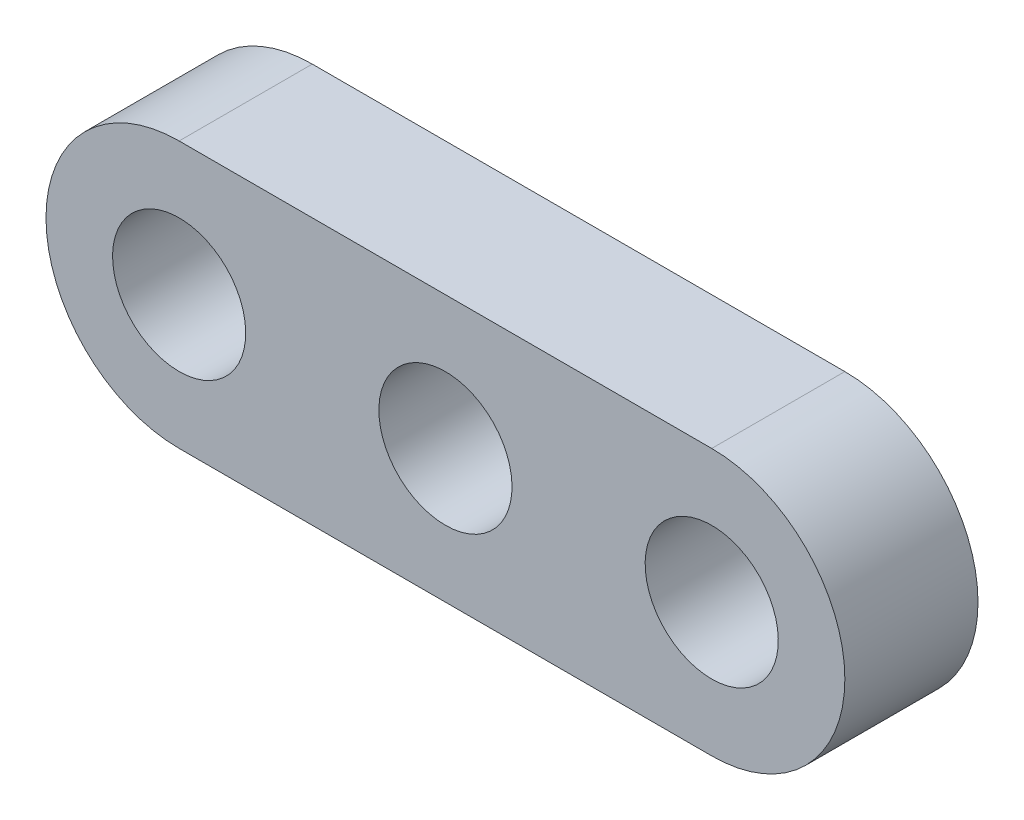
ISO-10303-21;
HEADER;
FILE_DESCRIPTION(('STEP AP214'),'2;1');
FILE_NAME('part.step','',(''),(''),'','','');
FILE_SCHEMA(('AUTOMOTIVE_DESIGN { 1 0 10303 214 1 1 1 1 }'));
ENDSEC;
DATA;
#1=APPLICATION_CONTEXT('core data for automotive mechanical design processes');
#2=APPLICATION_PROTOCOL_DEFINITION('international standard','automotive_design',2000,#1);
#3=PRODUCT_CONTEXT('',#1,'mechanical');
#4=PRODUCT('Part','Part','',(#3));
#5=PRODUCT_RELATED_PRODUCT_CATEGORY('part','',(#4));
#6=PRODUCT_DEFINITION_FORMATION('','',#4);
#7=PRODUCT_DEFINITION_CONTEXT('part definition',#1,'design');
#8=PRODUCT_DEFINITION('design','',#6,#7);
#9=PRODUCT_DEFINITION_SHAPE('','',#8);
#10=(LENGTH_UNIT() NAMED_UNIT(*) SI_UNIT(.MILLI.,.METRE.));
#11=(NAMED_UNIT(*) PLANE_ANGLE_UNIT() SI_UNIT($,.RADIAN.));
#12=(NAMED_UNIT(*) SI_UNIT($,.STERADIAN.) SOLID_ANGLE_UNIT());
#13=UNCERTAINTY_MEASURE_WITH_UNIT(LENGTH_MEASURE(1.E-05),#10,'distance_accuracy_value','');
#14=(GEOMETRIC_REPRESENTATION_CONTEXT(3) GLOBAL_UNCERTAINTY_ASSIGNED_CONTEXT((#13)) GLOBAL_UNIT_ASSIGNED_CONTEXT((#10,
#11,#12)) REPRESENTATION_CONTEXT('',''));
#15=CARTESIAN_POINT('',(0.,0.,0.));
#16=DIRECTION('',(0.,0.,1.));
#17=DIRECTION('',(1.,0.,0.));
#18=AXIS2_PLACEMENT_3D('',#15,#16,#17);
#19=CARTESIAN_POINT('',(8.,0.,4.));
#20=DIRECTION('',(0.,0.,1.));
#21=DIRECTION('',(0.,-1.,0.));
#22=AXIS2_PLACEMENT_3D('',#19,#20,#21);
#23=CYLINDRICAL_SURFACE('',#22,2.);
#24=CARTESIAN_POINT('',(8.,0.,0.));
#25=DIRECTION('',(0.,0.,1.));
#26=DIRECTION('',(0.,-1.,0.));
#27=AXIS2_PLACEMENT_3D('',#24,#25,#26);
#28=CIRCLE('',#27,2.);
#29=CARTESIAN_POINT('',(8.,-2.,0.));
#30=VERTEX_POINT('',#29);
#31=EDGE_CURVE('E88',#30,#30,#28,.T.);
#32=ORIENTED_EDGE('',*,*,#31,.F.);
#33=EDGE_LOOP('',(#32));
#34=FACE_BOUND('',#33,.T.);
#35=CARTESIAN_POINT('',(8.,0.,4.));
#36=DIRECTION('',(0.,0.,1.));
#37=DIRECTION('',(0.,-1.,0.));
#38=AXIS2_PLACEMENT_3D('',#35,#36,#37);
#39=CIRCLE('',#38,2.);
#40=CARTESIAN_POINT('',(8.,-2.,4.));
#41=VERTEX_POINT('',#40);
#42=EDGE_CURVE('E36',#41,#41,#39,.T.);
#43=ORIENTED_EDGE('',*,*,#42,.T.);
#44=EDGE_LOOP('',(#43));
#45=FACE_BOUND('',#44,.T.);
#46=ADVANCED_FACE('F17',(#34,#45),#23,.F.);
#47=CARTESIAN_POINT('',(0.,0.,4.));
#48=DIRECTION('',(0.,0.,1.));
#49=DIRECTION('',(0.,-1.,0.));
#50=AXIS2_PLACEMENT_3D('',#47,#48,#49);
#51=CYLINDRICAL_SURFACE('',#50,2.);
#52=CARTESIAN_POINT('',(0.,0.,0.));
#53=DIRECTION('',(0.,0.,1.));
#54=DIRECTION('',(0.,-1.,0.));
#55=AXIS2_PLACEMENT_3D('',#52,#53,#54);
#56=CIRCLE('',#55,2.);
#57=CARTESIAN_POINT('',(0.,-2.,0.));
#58=VERTEX_POINT('',#57);
#59=EDGE_CURVE('E94',#58,#58,#56,.T.);
#60=ORIENTED_EDGE('',*,*,#59,.F.);
#61=EDGE_LOOP('',(#60));
#62=FACE_BOUND('',#61,.T.);
#63=CARTESIAN_POINT('',(0.,0.,4.));
#64=DIRECTION('',(0.,0.,1.));
#65=DIRECTION('',(0.,-1.,0.));
#66=AXIS2_PLACEMENT_3D('',#63,#64,#65);
#67=CIRCLE('',#66,2.);
#68=CARTESIAN_POINT('',(0.,-2.,4.));
#69=VERTEX_POINT('',#68);
#70=EDGE_CURVE('E116',#69,#69,#67,.T.);
#71=ORIENTED_EDGE('',*,*,#70,.T.);
#72=EDGE_LOOP('',(#71));
#73=FACE_BOUND('',#72,.T.);
#74=ADVANCED_FACE('F167',(#62,#73),#51,.F.);
#75=CARTESIAN_POINT('',(-8.,0.,4.));
#76=DIRECTION('',(0.,0.,1.));
#77=DIRECTION('',(0.,-1.,0.));
#78=AXIS2_PLACEMENT_3D('',#75,#76,#77);
#79=CYLINDRICAL_SURFACE('',#78,2.);
#80=CARTESIAN_POINT('',(-8.,0.,0.));
#81=DIRECTION('',(0.,0.,1.));
#82=DIRECTION('',(0.,-1.,0.));
#83=AXIS2_PLACEMENT_3D('',#80,#81,#82);
#84=CIRCLE('',#83,2.);
#85=CARTESIAN_POINT('',(-8.,-2.,0.));
#86=VERTEX_POINT('',#85);
#87=EDGE_CURVE('E104',#86,#86,#84,.T.);
#88=ORIENTED_EDGE('',*,*,#87,.F.);
#89=EDGE_LOOP('',(#88));
#90=FACE_BOUND('',#89,.T.);
#91=CARTESIAN_POINT('',(-8.,0.,4.));
#92=DIRECTION('',(0.,0.,1.));
#93=DIRECTION('',(0.,-1.,0.));
#94=AXIS2_PLACEMENT_3D('',#91,#92,#93);
#95=CIRCLE('',#94,2.);
#96=CARTESIAN_POINT('',(-8.,-2.,4.));
#97=VERTEX_POINT('',#96);
#98=EDGE_CURVE('E119',#97,#97,#95,.T.);
#99=ORIENTED_EDGE('',*,*,#98,.T.);
#100=EDGE_LOOP('',(#99));
#101=FACE_BOUND('',#100,.T.);
#102=ADVANCED_FACE('F19',(#90,#101),#79,.F.);
#103=CARTESIAN_POINT('',(-8.,0.,4.));
#104=DIRECTION('',(0.,0.,-1.));
#105=DIRECTION('',(0.,1.,0.));
#106=AXIS2_PLACEMENT_3D('',#103,#104,#105);
#107=CYLINDRICAL_SURFACE('',#106,4.);
#108=CARTESIAN_POINT('',(-8.,0.,0.));
#109=DIRECTION('',(0.,0.,1.));
#110=DIRECTION('',(0.,-1.,0.));
#111=AXIS2_PLACEMENT_3D('',#108,#109,#110);
#112=CIRCLE('',#111,4.);
#113=CARTESIAN_POINT('',(-8.,4.,0.));
#114=VERTEX_POINT('',#113);
#115=CARTESIAN_POINT('',(-8.,-4.,0.));
#116=VERTEX_POINT('',#115);
#117=EDGE_CURVE('E142',#114,#116,#112,.T.);
#118=ORIENTED_EDGE('',*,*,#117,.T.);
#119=DIRECTION('',(0.,0.,-1.));
#120=VECTOR('',#119,1.);
#121=CARTESIAN_POINT('',(-8.,-4.,4.));
#122=LINE('',#121,#120);
#123=CARTESIAN_POINT('',(-8.,-4.,4.));
#124=VERTEX_POINT('',#123);
#125=EDGE_CURVE('E11',#124,#116,#122,.T.);
#126=ORIENTED_EDGE('',*,*,#125,.F.);
#127=CARTESIAN_POINT('',(-8.,0.,4.));
#128=DIRECTION('',(0.,0.,1.));
#129=DIRECTION('',(0.,-1.,0.));
#130=AXIS2_PLACEMENT_3D('',#127,#128,#129);
#131=CIRCLE('',#130,4.);
#132=CARTESIAN_POINT('',(-8.,4.,4.));
#133=VERTEX_POINT('',#132);
#134=EDGE_CURVE('E93',#133,#124,#131,.T.);
#135=ORIENTED_EDGE('',*,*,#134,.F.);
#136=DIRECTION('',(0.,0.,-1.));
#137=VECTOR('',#136,1.);
#138=CARTESIAN_POINT('',(-8.,4.,4.));
#139=LINE('',#138,#137);
#140=EDGE_CURVE('E124',#133,#114,#139,.T.);
#141=ORIENTED_EDGE('',*,*,#140,.T.);
#142=EDGE_LOOP('',(#118,#126,#135,#141));
#143=FACE_BOUND('',#142,.T.);
#144=ADVANCED_FACE('F166',(#143),#107,.T.);
#145=CARTESIAN_POINT('',(-8.,-4.,4.));
#146=DIRECTION('',(0.,1.,0.));
#147=DIRECTION('',(1.,0.,0.));
#148=AXIS2_PLACEMENT_3D('',#145,#146,#147);
#149=PLANE('',#148);
#150=DIRECTION('',(1.,0.,0.));
#151=VECTOR('',#150,1.);
#152=CARTESIAN_POINT('',(-8.,-4.,0.));
#153=LINE('',#152,#151);
#154=CARTESIAN_POINT('',(8.,-4.,0.));
#155=VERTEX_POINT('',#154);
#156=EDGE_CURVE('E155',#116,#155,#153,.T.);
#157=ORIENTED_EDGE('',*,*,#156,.T.);
#158=DIRECTION('',(0.,0.,-1.));
#159=VECTOR('',#158,1.);
#160=CARTESIAN_POINT('',(8.,-4.,4.));
#161=LINE('',#160,#159);
#162=CARTESIAN_POINT('',(8.,-4.,4.));
#163=VERTEX_POINT('',#162);
#164=EDGE_CURVE('E27',#163,#155,#161,.T.);
#165=ORIENTED_EDGE('',*,*,#164,.F.);
#166=DIRECTION('',(1.,0.,0.));
#167=VECTOR('',#166,1.);
#168=CARTESIAN_POINT('',(-8.,-4.,4.));
#169=LINE('',#168,#167);
#170=EDGE_CURVE('E102',#124,#163,#169,.T.);
#171=ORIENTED_EDGE('',*,*,#170,.F.);
#172=ORIENTED_EDGE('',*,*,#125,.T.);
#173=EDGE_LOOP('',(#157,#165,#171,#172));
#174=FACE_BOUND('',#173,.T.);
#175=ADVANCED_FACE('F182',(#174),#149,.F.);
#176=CARTESIAN_POINT('',(8.,0.,4.));
#177=DIRECTION('',(0.,0.,-1.));
#178=DIRECTION('',(0.,1.,0.));
#179=AXIS2_PLACEMENT_3D('',#176,#177,#178);
#180=CYLINDRICAL_SURFACE('',#179,4.);
#181=CARTESIAN_POINT('',(8.,0.,0.));
#182=DIRECTION('',(0.,0.,1.));
#183=DIRECTION('',(0.,-1.,0.));
#184=AXIS2_PLACEMENT_3D('',#181,#182,#183);
#185=CIRCLE('',#184,4.);
#186=CARTESIAN_POINT('',(8.,4.,0.));
#187=VERTEX_POINT('',#186);
#188=EDGE_CURVE('E149',#155,#187,#185,.T.);
#189=ORIENTED_EDGE('',*,*,#188,.T.);
#190=DIRECTION('',(0.,0.,-1.));
#191=VECTOR('',#190,1.);
#192=CARTESIAN_POINT('',(8.,4.,4.));
#193=LINE('',#192,#191);
#194=CARTESIAN_POINT('',(8.,4.,4.));
#195=VERTEX_POINT('',#194);
#196=EDGE_CURVE('E126',#195,#187,#193,.T.);
#197=ORIENTED_EDGE('',*,*,#196,.F.);
#198=CARTESIAN_POINT('',(8.,0.,4.));
#199=DIRECTION('',(0.,0.,1.));
#200=DIRECTION('',(0.,-1.,0.));
#201=AXIS2_PLACEMENT_3D('',#198,#199,#200);
#202=CIRCLE('',#201,4.);
#203=EDGE_CURVE('E108',#163,#195,#202,.T.);
#204=ORIENTED_EDGE('',*,*,#203,.F.);
#205=ORIENTED_EDGE('',*,*,#164,.T.);
#206=EDGE_LOOP('',(#189,#197,#204,#205));
#207=FACE_BOUND('',#206,.T.);
#208=ADVANCED_FACE('F184',(#207),#180,.T.);
#209=CARTESIAN_POINT('',(-8.,4.,4.));
#210=DIRECTION('',(0.,-1.,0.));
#211=DIRECTION('',(0.,0.,-1.));
#212=AXIS2_PLACEMENT_3D('',#209,#210,#211);
#213=PLANE('',#212);
#214=DIRECTION('',(-1.,0.,0.));
#215=VECTOR('',#214,1.);
#216=CARTESIAN_POINT('',(-8.,4.,0.));
#217=LINE('',#216,#215);
#218=EDGE_CURVE('E146',#187,#114,#217,.T.);
#219=ORIENTED_EDGE('',*,*,#218,.T.);
#220=ORIENTED_EDGE('',*,*,#140,.F.);
#221=DIRECTION('',(-1.,0.,0.));
#222=VECTOR('',#221,1.);
#223=CARTESIAN_POINT('',(-8.,4.,4.));
#224=LINE('',#223,#222);
#225=EDGE_CURVE('E112',#195,#133,#224,.T.);
#226=ORIENTED_EDGE('',*,*,#225,.F.);
#227=ORIENTED_EDGE('',*,*,#196,.T.);
#228=EDGE_LOOP('',(#219,#220,#226,#227));
#229=FACE_BOUND('',#228,.T.);
#230=ADVANCED_FACE('F173',(#229),#213,.F.);
#231=CARTESIAN_POINT('',(-8.,0.,4.));
#232=DIRECTION('',(0.,0.,1.));
#233=DIRECTION('',(1.,0.,0.));
#234=AXIS2_PLACEMENT_3D('',#231,#232,#233);
#235=PLANE('',#234);
#236=ORIENTED_EDGE('',*,*,#42,.F.);
#237=EDGE_LOOP('',(#236));
#238=FACE_BOUND('',#237,.T.);
#239=ORIENTED_EDGE('',*,*,#70,.F.);
#240=EDGE_LOOP('',(#239));
#241=FACE_BOUND('',#240,.T.);
#242=ORIENTED_EDGE('',*,*,#98,.F.);
#243=EDGE_LOOP('',(#242));
#244=FACE_BOUND('',#243,.T.);
#245=ORIENTED_EDGE('',*,*,#134,.T.);
#246=ORIENTED_EDGE('',*,*,#170,.T.);
#247=ORIENTED_EDGE('',*,*,#203,.T.);
#248=ORIENTED_EDGE('',*,*,#225,.T.);
#249=EDGE_LOOP('',(#245,#246,#247,#248));
#250=FACE_BOUND('',#249,.T.);
#251=ADVANCED_FACE('F170',(#238,#241,#244,#250),#235,.T.);
#252=CARTESIAN_POINT('',(-8.,0.,0.));
#253=DIRECTION('',(0.,0.,1.));
#254=DIRECTION('',(1.,0.,0.));
#255=AXIS2_PLACEMENT_3D('',#252,#253,#254);
#256=PLANE('',#255);
#257=ORIENTED_EDGE('',*,*,#31,.T.);
#258=EDGE_LOOP('',(#257));
#259=FACE_BOUND('',#258,.T.);
#260=ORIENTED_EDGE('',*,*,#59,.T.);
#261=EDGE_LOOP('',(#260));
#262=FACE_BOUND('',#261,.T.);
#263=ORIENTED_EDGE('',*,*,#87,.T.);
#264=EDGE_LOOP('',(#263));
#265=FACE_BOUND('',#264,.T.);
#266=ORIENTED_EDGE('',*,*,#117,.F.);
#267=ORIENTED_EDGE('',*,*,#218,.F.);
#268=ORIENTED_EDGE('',*,*,#188,.F.);
#269=ORIENTED_EDGE('',*,*,#156,.F.);
#270=EDGE_LOOP('',(#266,#267,#268,#269));
#271=FACE_BOUND('',#270,.T.);
#272=ADVANCED_FACE('F89',(#259,#262,#265,#271),#256,.F.);
#273=CLOSED_SHELL('',(#46,#74,#102,#144,#175,#208,#230,#251,#272));
#274=MANIFOLD_SOLID_BREP('B1',#273);
#275=ADVANCED_BREP_SHAPE_REPRESENTATION('',(#18,#274),#14);
#276=SHAPE_DEFINITION_REPRESENTATION(#9,#275);
ENDSEC;
END-ISO-10303-21;
